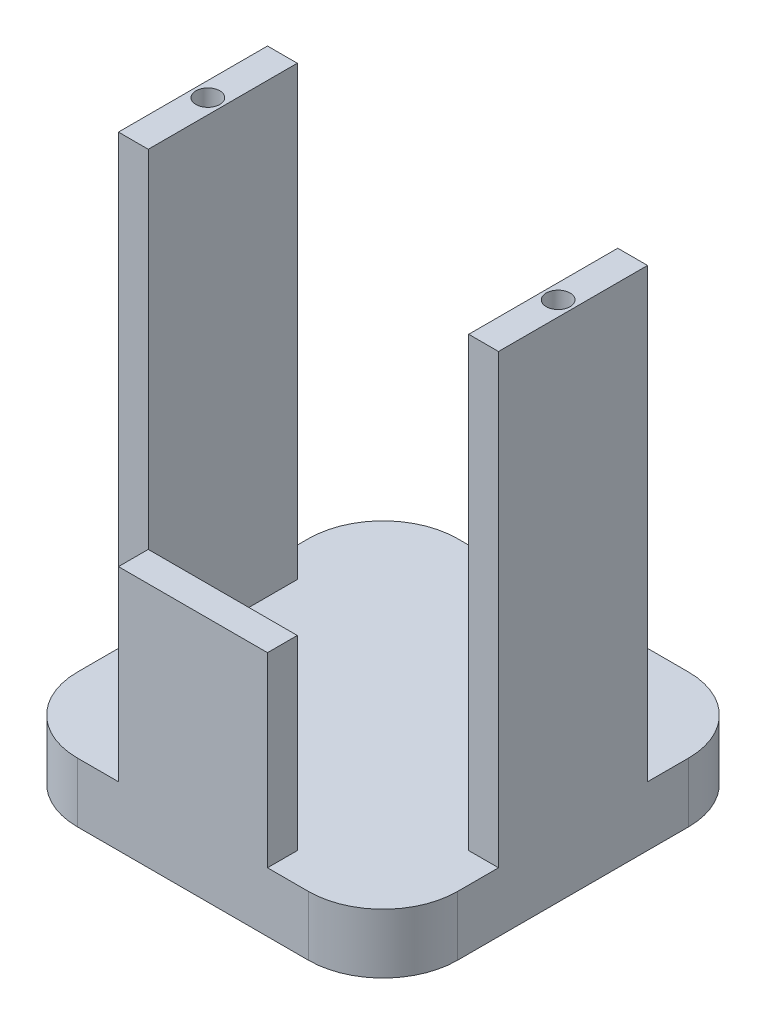
ISO-10303-21;
HEADER;
FILE_DESCRIPTION(('STEP AP214'),'2;1');
FILE_NAME('part.step','',(''),(''),'','','');
FILE_SCHEMA(('AUTOMOTIVE_DESIGN { 1 0 10303 214 1 1 1 1 }'));
ENDSEC;
DATA;
#1=APPLICATION_CONTEXT('core data for automotive mechanical design processes');
#2=APPLICATION_PROTOCOL_DEFINITION('international standard','automotive_design',2000,#1);
#3=PRODUCT_CONTEXT('',#1,'mechanical');
#4=PRODUCT('Part','Part','',(#3));
#5=PRODUCT_RELATED_PRODUCT_CATEGORY('part','',(#4));
#6=PRODUCT_DEFINITION_FORMATION('','',#4);
#7=PRODUCT_DEFINITION_CONTEXT('part definition',#1,'design');
#8=PRODUCT_DEFINITION('design','',#6,#7);
#9=PRODUCT_DEFINITION_SHAPE('','',#8);
#10=(LENGTH_UNIT() NAMED_UNIT(*) SI_UNIT(.MILLI.,.METRE.));
#11=(NAMED_UNIT(*) PLANE_ANGLE_UNIT() SI_UNIT($,.RADIAN.));
#12=(NAMED_UNIT(*) SI_UNIT($,.STERADIAN.) SOLID_ANGLE_UNIT());
#13=UNCERTAINTY_MEASURE_WITH_UNIT(LENGTH_MEASURE(1.E-05),#10,'distance_accuracy_value','');
#14=(GEOMETRIC_REPRESENTATION_CONTEXT(3) GLOBAL_UNCERTAINTY_ASSIGNED_CONTEXT((#13)) GLOBAL_UNIT_ASSIGNED_CONTEXT((#10,
#11,#12)) REPRESENTATION_CONTEXT('',''));
#15=CARTESIAN_POINT('',(0.,0.,0.));
#16=DIRECTION('',(0.,0.,1.));
#17=DIRECTION('',(1.,0.,0.));
#18=AXIS2_PLACEMENT_3D('',#15,#16,#17);
#19=CARTESIAN_POINT('',(0.,8.,0.));
#20=DIRECTION('',(0.,-1.,0.));
#21=DIRECTION('',(0.,0.,-1.));
#22=AXIS2_PLACEMENT_3D('',#19,#20,#21);
#23=PLANE('',#22);
#24=DIRECTION('',(-1.,0.,0.));
#25=VECTOR('',#24,1.);
#26=CARTESIAN_POINT('',(-25.5,8.,-25.5));
#27=LINE('',#26,#25);
#28=CARTESIAN_POINT('',(-10.,8.,-25.5));
#29=VERTEX_POINT('',#28);
#30=CARTESIAN_POINT('',(-15.5,8.,-25.5));
#31=VERTEX_POINT('',#30);
#32=EDGE_CURVE('E354',#29,#31,#27,.T.);
#33=ORIENTED_EDGE('',*,*,#32,.T.);
#34=CARTESIAN_POINT('',(-15.5,8.,-15.5));
#35=DIRECTION('',(0.,-1.,0.));
#36=DIRECTION('',(0.,0.,-1.));
#37=AXIS2_PLACEMENT_3D('',#34,#35,#36);
#38=CIRCLE('',#37,10.);
#39=CARTESIAN_POINT('',(-25.5,8.,-15.5));
#40=VERTEX_POINT('',#39);
#41=EDGE_CURVE('E392',#31,#40,#38,.F.);
#42=ORIENTED_EDGE('',*,*,#41,.T.);
#43=DIRECTION('',(0.,0.,1.));
#44=VECTOR('',#43,1.);
#45=CARTESIAN_POINT('',(-25.5,8.,25.5));
#46=LINE('',#45,#44);
#47=CARTESIAN_POINT('',(-25.5,8.,-10.));
#48=VERTEX_POINT('',#47);
#49=EDGE_CURVE('E212',#40,#48,#46,.T.);
#50=ORIENTED_EDGE('',*,*,#49,.T.);
#51=DIRECTION('',(-1.,0.,0.));
#52=VECTOR('',#51,1.);
#53=CARTESIAN_POINT('',(-25.5,8.,-10.));
#54=LINE('',#53,#52);
#55=CARTESIAN_POINT('',(-21.5,8.,-10.));
#56=VERTEX_POINT('',#55);
#57=EDGE_CURVE('E326',#56,#48,#54,.T.);
#58=ORIENTED_EDGE('',*,*,#57,.F.);
#59=DIRECTION('',(0.,0.,-1.));
#60=VECTOR('',#59,1.);
#61=CARTESIAN_POINT('',(-21.5,8.,-10.));
#62=LINE('',#61,#60);
#63=CARTESIAN_POINT('',(-21.5,8.,10.));
#64=VERTEX_POINT('',#63);
#65=EDGE_CURVE('E335',#64,#56,#62,.T.);
#66=ORIENTED_EDGE('',*,*,#65,.F.);
#67=DIRECTION('',(1.,0.,0.));
#68=VECTOR('',#67,1.);
#69=CARTESIAN_POINT('',(-25.5,8.,10.));
#70=LINE('',#69,#68);
#71=CARTESIAN_POINT('',(-25.5,8.,10.));
#72=VERTEX_POINT('',#71);
#73=EDGE_CURVE('E314',#72,#64,#70,.T.);
#74=ORIENTED_EDGE('',*,*,#73,.F.);
#75=CARTESIAN_POINT('',(-25.5,8.,15.5));
#76=VERTEX_POINT('',#75);
#77=EDGE_CURVE('E358',#72,#76,#46,.T.);
#78=ORIENTED_EDGE('',*,*,#77,.T.);
#79=CARTESIAN_POINT('',(-15.5,8.,15.5));
#80=DIRECTION('',(0.,-1.,0.));
#81=DIRECTION('',(0.,0.,-1.));
#82=AXIS2_PLACEMENT_3D('',#79,#80,#81);
#83=CIRCLE('',#82,10.);
#84=CARTESIAN_POINT('',(-15.5,8.,25.5));
#85=VERTEX_POINT('',#84);
#86=EDGE_CURVE('E54',#76,#85,#83,.F.);
#87=ORIENTED_EDGE('',*,*,#86,.T.);
#88=DIRECTION('',(1.,0.,0.));
#89=VECTOR('',#88,1.);
#90=CARTESIAN_POINT('',(-25.5,8.,25.5));
#91=LINE('',#90,#89);
#92=CARTESIAN_POINT('',(-10.,8.,25.5));
#93=VERTEX_POINT('',#92);
#94=EDGE_CURVE('E211',#85,#93,#91,.T.);
#95=ORIENTED_EDGE('',*,*,#94,.T.);
#96=DIRECTION('',(0.,0.,1.));
#97=VECTOR('',#96,1.);
#98=CARTESIAN_POINT('',(-10.,8.,25.5));
#99=LINE('',#98,#97);
#100=CARTESIAN_POINT('',(-10.,8.,21.5));
#101=VERTEX_POINT('',#100);
#102=EDGE_CURVE('E222',#101,#93,#99,.T.);
#103=ORIENTED_EDGE('',*,*,#102,.F.);
#104=DIRECTION('',(-1.,0.,0.));
#105=VECTOR('',#104,1.);
#106=CARTESIAN_POINT('',(-10.,8.,21.5));
#107=LINE('',#106,#105);
#108=CARTESIAN_POINT('',(10.,8.,21.5));
#109=VERTEX_POINT('',#108);
#110=EDGE_CURVE('E218',#109,#101,#107,.T.);
#111=ORIENTED_EDGE('',*,*,#110,.F.);
#112=DIRECTION('',(0.,0.,-1.));
#113=VECTOR('',#112,1.);
#114=CARTESIAN_POINT('',(10.,8.,25.5));
#115=LINE('',#114,#113);
#116=CARTESIAN_POINT('',(10.,8.,25.5));
#117=VERTEX_POINT('',#116);
#118=EDGE_CURVE('E215',#117,#109,#115,.T.);
#119=ORIENTED_EDGE('',*,*,#118,.F.);
#120=CARTESIAN_POINT('',(15.5,8.,25.5));
#121=VERTEX_POINT('',#120);
#122=EDGE_CURVE('E202',#117,#121,#91,.T.);
#123=ORIENTED_EDGE('',*,*,#122,.T.);
#124=CARTESIAN_POINT('',(15.5,8.,15.5));
#125=DIRECTION('',(0.,-1.,0.));
#126=DIRECTION('',(0.,0.,-1.));
#127=AXIS2_PLACEMENT_3D('',#124,#125,#126);
#128=CIRCLE('',#127,10.);
#129=CARTESIAN_POINT('',(25.5,8.,15.5));
#130=VERTEX_POINT('',#129);
#131=EDGE_CURVE('E387',#121,#130,#128,.F.);
#132=ORIENTED_EDGE('',*,*,#131,.T.);
#133=DIRECTION('',(0.,0.,-1.));
#134=VECTOR('',#133,1.);
#135=CARTESIAN_POINT('',(25.5,8.,25.5));
#136=LINE('',#135,#134);
#137=CARTESIAN_POINT('',(25.5,8.,10.));
#138=VERTEX_POINT('',#137);
#139=EDGE_CURVE('E352',#130,#138,#136,.T.);
#140=ORIENTED_EDGE('',*,*,#139,.T.);
#141=DIRECTION('',(1.,0.,0.));
#142=VECTOR('',#141,1.);
#143=CARTESIAN_POINT('',(25.5,8.,10.));
#144=LINE('',#143,#142);
#145=CARTESIAN_POINT('',(21.5,8.,10.));
#146=VERTEX_POINT('',#145);
#147=EDGE_CURVE('E304',#146,#138,#144,.T.);
#148=ORIENTED_EDGE('',*,*,#147,.F.);
#149=DIRECTION('',(0.,0.,1.));
#150=VECTOR('',#149,1.);
#151=CARTESIAN_POINT('',(21.5,8.,-10.));
#152=LINE('',#151,#150);
#153=CARTESIAN_POINT('',(21.5,8.,-10.));
#154=VERTEX_POINT('',#153);
#155=EDGE_CURVE('E307',#154,#146,#152,.T.);
#156=ORIENTED_EDGE('',*,*,#155,.F.);
#157=DIRECTION('',(-1.,0.,0.));
#158=VECTOR('',#157,1.);
#159=CARTESIAN_POINT('',(25.5,8.,-10.));
#160=LINE('',#159,#158);
#161=CARTESIAN_POINT('',(25.5,8.,-10.));
#162=VERTEX_POINT('',#161);
#163=EDGE_CURVE('E311',#162,#154,#160,.T.);
#164=ORIENTED_EDGE('',*,*,#163,.F.);
#165=CARTESIAN_POINT('',(25.5,8.,-15.5));
#166=VERTEX_POINT('',#165);
#167=EDGE_CURVE('E355',#162,#166,#136,.T.);
#168=ORIENTED_EDGE('',*,*,#167,.T.);
#169=CARTESIAN_POINT('',(15.5,8.,-15.5));
#170=DIRECTION('',(0.,-1.,0.));
#171=DIRECTION('',(0.,0.,-1.));
#172=AXIS2_PLACEMENT_3D('',#169,#170,#171);
#173=CIRCLE('',#172,10.);
#174=CARTESIAN_POINT('',(15.5,8.,-25.5));
#175=VERTEX_POINT('',#174);
#176=EDGE_CURVE('E390',#166,#175,#173,.F.);
#177=ORIENTED_EDGE('',*,*,#176,.T.);
#178=CARTESIAN_POINT('',(9.99999999999999,8.,-25.5));
#179=VERTEX_POINT('',#178);
#180=EDGE_CURVE('E356',#175,#179,#27,.T.);
#181=ORIENTED_EDGE('',*,*,#180,.T.);
#182=DIRECTION('',(0.,0.,-1.));
#183=VECTOR('',#182,1.);
#184=CARTESIAN_POINT('',(9.99999999999999,8.,-25.5));
#185=LINE('',#184,#183);
#186=CARTESIAN_POINT('',(9.99999999999999,8.,-21.5));
#187=VERTEX_POINT('',#186);
#188=EDGE_CURVE('E254',#187,#179,#185,.T.);
#189=ORIENTED_EDGE('',*,*,#188,.F.);
#190=DIRECTION('',(1.,0.,0.));
#191=VECTOR('',#190,1.);
#192=CARTESIAN_POINT('',(-10.,8.,-21.5));
#193=LINE('',#192,#191);
#194=CARTESIAN_POINT('',(-10.,8.,-21.5));
#195=VERTEX_POINT('',#194);
#196=EDGE_CURVE('E263',#195,#187,#193,.T.);
#197=ORIENTED_EDGE('',*,*,#196,.F.);
#198=DIRECTION('',(0.,0.,1.));
#199=VECTOR('',#198,1.);
#200=CARTESIAN_POINT('',(-10.,8.,-25.5));
#201=LINE('',#200,#199);
#202=EDGE_CURVE('E243',#29,#195,#201,.T.);
#203=ORIENTED_EDGE('',*,*,#202,.F.);
#204=EDGE_LOOP('',(#33,#42,#50,#58,#66,#74,#78,#87,#95,#103,#111,#119,#123,#132,#140,#148,#156,
#164,#168,#177,#181,#189,#197,#203));
#205=FACE_BOUND('',#204,.T.);
#206=ADVANCED_FACE('F39',(#205),#23,.F.);
#207=CARTESIAN_POINT('',(25.5,8.,25.5));
#208=DIRECTION('',(-1.,0.,0.));
#209=DIRECTION('',(0.,0.,1.));
#210=AXIS2_PLACEMENT_3D('',#207,#208,#209);
#211=PLANE('',#210);
#212=DIRECTION('',(0.,0.,-1.));
#213=VECTOR('',#212,1.);
#214=CARTESIAN_POINT('',(25.5,0.,25.5));
#215=LINE('',#214,#213);
#216=CARTESIAN_POINT('',(25.5,0.,15.5));
#217=VERTEX_POINT('',#216);
#218=CARTESIAN_POINT('',(25.5,0.,-15.5));
#219=VERTEX_POINT('',#218);
#220=EDGE_CURVE('E351',#217,#219,#215,.T.);
#221=ORIENTED_EDGE('',*,*,#220,.T.);
#222=DIRECTION('',(0.,-1.,0.));
#223=VECTOR('',#222,1.);
#224=CARTESIAN_POINT('',(25.5,8.,-15.5));
#225=LINE('',#224,#223);
#226=EDGE_CURVE('E62',#219,#166,#225,.F.);
#227=ORIENTED_EDGE('',*,*,#226,.T.);
#228=ORIENTED_EDGE('',*,*,#167,.F.);
#229=DIRECTION('',(0.,-1.,0.));
#230=VECTOR('',#229,1.);
#231=CARTESIAN_POINT('',(25.5,68.,-10.));
#232=LINE('',#231,#230);
#233=CARTESIAN_POINT('',(25.5,68.,-10.));
#234=VERTEX_POINT('',#233);
#235=EDGE_CURVE('E283',#234,#162,#232,.T.);
#236=ORIENTED_EDGE('',*,*,#235,.F.);
#237=DIRECTION('',(0.,0.,-1.));
#238=VECTOR('',#237,1.);
#239=CARTESIAN_POINT('',(25.5,68.,-10.));
#240=LINE('',#239,#238);
#241=CARTESIAN_POINT('',(25.5,68.,10.));
#242=VERTEX_POINT('',#241);
#243=EDGE_CURVE('E308',#242,#234,#240,.T.);
#244=ORIENTED_EDGE('',*,*,#243,.F.);
#245=DIRECTION('',(0.,-1.,0.));
#246=VECTOR('',#245,1.);
#247=CARTESIAN_POINT('',(25.5,68.,10.));
#248=LINE('',#247,#246);
#249=EDGE_CURVE('E300',#242,#138,#248,.T.);
#250=ORIENTED_EDGE('',*,*,#249,.T.);
#251=ORIENTED_EDGE('',*,*,#139,.F.);
#252=DIRECTION('',(0.,-1.,0.));
#253=VECTOR('',#252,1.);
#254=CARTESIAN_POINT('',(25.5,8.,15.5));
#255=LINE('',#254,#253);
#256=EDGE_CURVE('E394',#130,#217,#255,.T.);
#257=ORIENTED_EDGE('',*,*,#256,.T.);
#258=EDGE_LOOP('',(#221,#227,#228,#236,#244,#250,#251,#257));
#259=FACE_BOUND('',#258,.T.);
#260=ADVANCED_FACE('F400',(#259),#211,.F.);
#261=CARTESIAN_POINT('',(-25.5,8.,-25.5));
#262=DIRECTION('',(0.,0.,1.));
#263=DIRECTION('',(1.,0.,0.));
#264=AXIS2_PLACEMENT_3D('',#261,#262,#263);
#265=PLANE('',#264);
#266=DIRECTION('',(-1.,0.,0.));
#267=VECTOR('',#266,1.);
#268=CARTESIAN_POINT('',(-25.5,0.,-25.5));
#269=LINE('',#268,#267);
#270=CARTESIAN_POINT('',(15.5,0.,-25.5));
#271=VERTEX_POINT('',#270);
#272=CARTESIAN_POINT('',(-15.5,0.,-25.5));
#273=VERTEX_POINT('',#272);
#274=EDGE_CURVE('E362',#271,#273,#269,.T.);
#275=ORIENTED_EDGE('',*,*,#274,.T.);
#276=DIRECTION('',(0.,-1.,0.));
#277=VECTOR('',#276,1.);
#278=CARTESIAN_POINT('',(-15.5,8.,-25.5));
#279=LINE('',#278,#277);
#280=EDGE_CURVE('E385',#273,#31,#279,.F.);
#281=ORIENTED_EDGE('',*,*,#280,.T.);
#282=ORIENTED_EDGE('',*,*,#32,.F.);
#283=DIRECTION('',(0.,-1.,0.));
#284=VECTOR('',#283,1.);
#285=CARTESIAN_POINT('',(-10.,33.,-25.5));
#286=LINE('',#285,#284);
#287=CARTESIAN_POINT('',(-10.,33.,-25.5));
#288=VERTEX_POINT('',#287);
#289=EDGE_CURVE('E260',#288,#29,#286,.T.);
#290=ORIENTED_EDGE('',*,*,#289,.F.);
#291=DIRECTION('',(-1.,0.,0.));
#292=VECTOR('',#291,1.);
#293=CARTESIAN_POINT('',(-10.,33.,-25.5));
#294=LINE('',#293,#292);
#295=CARTESIAN_POINT('',(9.99999999999999,33.,-25.5));
#296=VERTEX_POINT('',#295);
#297=EDGE_CURVE('E258',#296,#288,#294,.T.);
#298=ORIENTED_EDGE('',*,*,#297,.F.);
#299=DIRECTION('',(0.,-1.,0.));
#300=VECTOR('',#299,1.);
#301=CARTESIAN_POINT('',(9.99999999999999,33.,-25.5));
#302=LINE('',#301,#300);
#303=EDGE_CURVE('E270',#296,#179,#302,.T.);
#304=ORIENTED_EDGE('',*,*,#303,.T.);
#305=ORIENTED_EDGE('',*,*,#180,.F.);
#306=DIRECTION('',(0.,-1.,0.));
#307=VECTOR('',#306,1.);
#308=CARTESIAN_POINT('',(15.5,8.,-25.5));
#309=LINE('',#308,#307);
#310=EDGE_CURVE('E382',#175,#271,#309,.T.);
#311=ORIENTED_EDGE('',*,*,#310,.T.);
#312=EDGE_LOOP('',(#275,#281,#282,#290,#298,#304,#305,#311));
#313=FACE_BOUND('',#312,.T.);
#314=ADVANCED_FACE('F413',(#313),#265,.F.);
#315=CARTESIAN_POINT('',(-25.5,8.,25.5));
#316=DIRECTION('',(1.,0.,0.));
#317=DIRECTION('',(0.,0.,-1.));
#318=AXIS2_PLACEMENT_3D('',#315,#316,#317);
#319=PLANE('',#318);
#320=ORIENTED_EDGE('',*,*,#49,.F.);
#321=DIRECTION('',(0.,-1.,0.));
#322=VECTOR('',#321,1.);
#323=CARTESIAN_POINT('',(-25.5,8.,-15.5));
#324=LINE('',#323,#322);
#325=CARTESIAN_POINT('',(-25.5,0.,-15.5));
#326=VERTEX_POINT('',#325);
#327=EDGE_CURVE('E371',#40,#326,#324,.T.);
#328=ORIENTED_EDGE('',*,*,#327,.T.);
#329=DIRECTION('',(0.,0.,1.));
#330=VECTOR('',#329,1.);
#331=CARTESIAN_POINT('',(-25.5,0.,25.5));
#332=LINE('',#331,#330);
#333=CARTESIAN_POINT('',(-25.5,0.,15.5));
#334=VERTEX_POINT('',#333);
#335=EDGE_CURVE('E365',#326,#334,#332,.T.);
#336=ORIENTED_EDGE('',*,*,#335,.T.);
#337=DIRECTION('',(0.,-1.,0.));
#338=VECTOR('',#337,1.);
#339=CARTESIAN_POINT('',(-25.5,8.,15.5));
#340=LINE('',#339,#338);
#341=EDGE_CURVE('E360',#334,#76,#340,.F.);
#342=ORIENTED_EDGE('',*,*,#341,.T.);
#343=ORIENTED_EDGE('',*,*,#77,.F.);
#344=DIRECTION('',(0.,-1.,0.));
#345=VECTOR('',#344,1.);
#346=CARTESIAN_POINT('',(-25.5,68.,10.));
#347=LINE('',#346,#345);
#348=CARTESIAN_POINT('',(-25.5,68.,10.));
#349=VERTEX_POINT('',#348);
#350=EDGE_CURVE('E348',#349,#72,#347,.T.);
#351=ORIENTED_EDGE('',*,*,#350,.F.);
#352=DIRECTION('',(0.,0.,1.));
#353=VECTOR('',#352,1.);
#354=CARTESIAN_POINT('',(-25.5,68.,-10.));
#355=LINE('',#354,#353);
#356=CARTESIAN_POINT('',(-25.5,68.,-10.));
#357=VERTEX_POINT('',#356);
#358=EDGE_CURVE('E322',#357,#349,#355,.T.);
#359=ORIENTED_EDGE('',*,*,#358,.F.);
#360=DIRECTION('',(0.,-1.,0.));
#361=VECTOR('',#360,1.);
#362=CARTESIAN_POINT('',(-25.5,68.,-10.));
#363=LINE('',#362,#361);
#364=EDGE_CURVE('E332',#357,#48,#363,.T.);
#365=ORIENTED_EDGE('',*,*,#364,.T.);
#366=EDGE_LOOP('',(#320,#328,#336,#342,#343,#351,#359,#365));
#367=FACE_BOUND('',#366,.T.);
#368=ADVANCED_FACE('F435',(#367),#319,.F.);
#369=CARTESIAN_POINT('',(-25.5,8.,25.5));
#370=DIRECTION('',(0.,0.,-1.));
#371=DIRECTION('',(-1.,0.,0.));
#372=AXIS2_PLACEMENT_3D('',#369,#370,#371);
#373=PLANE('',#372);
#374=ORIENTED_EDGE('',*,*,#94,.F.);
#375=DIRECTION('',(0.,-1.,0.));
#376=VECTOR('',#375,1.);
#377=CARTESIAN_POINT('',(-15.5,8.,25.5));
#378=LINE('',#377,#376);
#379=CARTESIAN_POINT('',(-15.5,0.,25.5));
#380=VERTEX_POINT('',#379);
#381=EDGE_CURVE('E11',#85,#380,#378,.T.);
#382=ORIENTED_EDGE('',*,*,#381,.T.);
#383=DIRECTION('',(1.,0.,0.));
#384=VECTOR('',#383,1.);
#385=CARTESIAN_POINT('',(-25.5,0.,25.5));
#386=LINE('',#385,#384);
#387=CARTESIAN_POINT('',(15.5,0.,25.5));
#388=VERTEX_POINT('',#387);
#389=EDGE_CURVE('E368',#380,#388,#386,.T.);
#390=ORIENTED_EDGE('',*,*,#389,.T.);
#391=DIRECTION('',(0.,-1.,0.));
#392=VECTOR('',#391,1.);
#393=CARTESIAN_POINT('',(15.5,8.,25.5));
#394=LINE('',#393,#392);
#395=EDGE_CURVE('E47',#388,#121,#394,.F.);
#396=ORIENTED_EDGE('',*,*,#395,.T.);
#397=ORIENTED_EDGE('',*,*,#122,.F.);
#398=DIRECTION('',(0.,-1.,0.));
#399=VECTOR('',#398,1.);
#400=CARTESIAN_POINT('',(10.,33.,25.5));
#401=LINE('',#400,#399);
#402=CARTESIAN_POINT('',(10.,33.,25.5));
#403=VERTEX_POINT('',#402);
#404=EDGE_CURVE('E206',#403,#117,#401,.T.);
#405=ORIENTED_EDGE('',*,*,#404,.F.);
#406=DIRECTION('',(1.,0.,0.));
#407=VECTOR('',#406,1.);
#408=CARTESIAN_POINT('',(-10.,33.,25.5));
#409=LINE('',#408,#407);
#410=CARTESIAN_POINT('',(-10.,33.,25.5));
#411=VERTEX_POINT('',#410);
#412=EDGE_CURVE('E246',#411,#403,#409,.T.);
#413=ORIENTED_EDGE('',*,*,#412,.F.);
#414=DIRECTION('',(0.,-1.,0.));
#415=VECTOR('',#414,1.);
#416=CARTESIAN_POINT('',(-10.,33.,25.5));
#417=LINE('',#416,#415);
#418=EDGE_CURVE('E227',#411,#93,#417,.T.);
#419=ORIENTED_EDGE('',*,*,#418,.T.);
#420=EDGE_LOOP('',(#374,#382,#390,#396,#397,#405,#413,#419));
#421=FACE_BOUND('',#420,.T.);
#422=ADVANCED_FACE('F204',(#421),#373,.F.);
#423=CARTESIAN_POINT('',(0.,0.,0.));
#424=DIRECTION('',(0.,-1.,0.));
#425=DIRECTION('',(0.,0.,-1.));
#426=AXIS2_PLACEMENT_3D('',#423,#424,#425);
#427=PLANE('',#426);
#428=CARTESIAN_POINT('',(-11.,0.,-11.));
#429=DIRECTION('',(0.,-1.,0.));
#430=DIRECTION('',(0.,0.,1.));
#431=AXIS2_PLACEMENT_3D('',#428,#429,#430);
#432=CIRCLE('',#431,1.6);
#433=CARTESIAN_POINT('',(-11.,0.,-9.4));
#434=VERTEX_POINT('',#433);
#435=EDGE_CURVE('E826',#434,#434,#432,.T.);
#436=ORIENTED_EDGE('',*,*,#435,.F.);
#437=EDGE_LOOP('',(#436));
#438=FACE_BOUND('',#437,.T.);
#439=CARTESIAN_POINT('',(11.,0.,-11.));
#440=DIRECTION('',(0.,-1.,0.));
#441=DIRECTION('',(0.,0.,-1.));
#442=AXIS2_PLACEMENT_3D('',#439,#440,#441);
#443=CIRCLE('',#442,1.59999999999999);
#444=CARTESIAN_POINT('',(11.,0.,-12.6));
#445=VERTEX_POINT('',#444);
#446=EDGE_CURVE('E845',#445,#445,#443,.T.);
#447=ORIENTED_EDGE('',*,*,#446,.F.);
#448=EDGE_LOOP('',(#447));
#449=FACE_BOUND('',#448,.T.);
#450=CARTESIAN_POINT('',(11.,0.,11.));
#451=DIRECTION('',(0.,-1.,0.));
#452=DIRECTION('',(0.,0.,1.));
#453=AXIS2_PLACEMENT_3D('',#450,#451,#452);
#454=CIRCLE('',#453,1.6);
#455=CARTESIAN_POINT('',(11.,0.,12.6));
#456=VERTEX_POINT('',#455);
#457=EDGE_CURVE('E836',#456,#456,#454,.T.);
#458=ORIENTED_EDGE('',*,*,#457,.F.);
#459=EDGE_LOOP('',(#458));
#460=FACE_BOUND('',#459,.T.);
#461=CARTESIAN_POINT('',(-11.,0.,11.));
#462=DIRECTION('',(0.,-1.,0.));
#463=DIRECTION('',(0.,0.,-1.));
#464=AXIS2_PLACEMENT_3D('',#461,#462,#463);
#465=CIRCLE('',#464,1.6);
#466=CARTESIAN_POINT('',(-11.,0.,9.4));
#467=VERTEX_POINT('',#466);
#468=EDGE_CURVE('E834',#467,#467,#465,.T.);
#469=ORIENTED_EDGE('',*,*,#468,.F.);
#470=EDGE_LOOP('',(#469));
#471=FACE_BOUND('',#470,.T.);
#472=ORIENTED_EDGE('',*,*,#335,.F.);
#473=CARTESIAN_POINT('',(-15.5,0.,-15.5));
#474=DIRECTION('',(0.,-1.,0.));
#475=DIRECTION('',(0.,0.,-1.));
#476=AXIS2_PLACEMENT_3D('',#473,#474,#475);
#477=CIRCLE('',#476,10.);
#478=EDGE_CURVE('E380',#326,#273,#477,.T.);
#479=ORIENTED_EDGE('',*,*,#478,.T.);
#480=ORIENTED_EDGE('',*,*,#274,.F.);
#481=CARTESIAN_POINT('',(15.5,0.,-15.5));
#482=DIRECTION('',(0.,-1.,0.));
#483=DIRECTION('',(0.,0.,-1.));
#484=AXIS2_PLACEMENT_3D('',#481,#482,#483);
#485=CIRCLE('',#484,10.);
#486=EDGE_CURVE('E378',#271,#219,#485,.T.);
#487=ORIENTED_EDGE('',*,*,#486,.T.);
#488=ORIENTED_EDGE('',*,*,#220,.F.);
#489=CARTESIAN_POINT('',(15.5,0.,15.5));
#490=DIRECTION('',(0.,-1.,0.));
#491=DIRECTION('',(0.,0.,-1.));
#492=AXIS2_PLACEMENT_3D('',#489,#490,#491);
#493=CIRCLE('',#492,10.);
#494=EDGE_CURVE('E374',#217,#388,#493,.T.);
#495=ORIENTED_EDGE('',*,*,#494,.T.);
#496=ORIENTED_EDGE('',*,*,#389,.F.);
#497=CARTESIAN_POINT('',(-15.5,0.,15.5));
#498=DIRECTION('',(0.,-1.,0.));
#499=DIRECTION('',(0.,0.,-1.));
#500=AXIS2_PLACEMENT_3D('',#497,#498,#499);
#501=CIRCLE('',#500,10.);
#502=EDGE_CURVE('E376',#380,#334,#501,.T.);
#503=ORIENTED_EDGE('',*,*,#502,.T.);
#504=EDGE_LOOP('',(#472,#479,#480,#487,#488,#495,#496,#503));
#505=FACE_BOUND('',#504,.T.);
#506=ADVANCED_FACE('F404',(#438,#449,#460,#471,#505),#427,.T.);
#507=CARTESIAN_POINT('',(-25.5,68.,10.));
#508=DIRECTION('',(0.,0.,-1.));
#509=DIRECTION('',(-1.,0.,0.));
#510=AXIS2_PLACEMENT_3D('',#507,#508,#509);
#511=PLANE('',#510);
#512=ORIENTED_EDGE('',*,*,#73,.T.);
#513=DIRECTION('',(0.,-1.,0.));
#514=VECTOR('',#513,1.);
#515=CARTESIAN_POINT('',(-21.5,68.,10.));
#516=LINE('',#515,#514);
#517=CARTESIAN_POINT('',(-21.5,68.,10.));
#518=VERTEX_POINT('',#517);
#519=EDGE_CURVE('E345',#518,#64,#516,.T.);
#520=ORIENTED_EDGE('',*,*,#519,.F.);
#521=DIRECTION('',(1.,0.,0.));
#522=VECTOR('',#521,1.);
#523=CARTESIAN_POINT('',(-25.5,68.,10.));
#524=LINE('',#523,#522);
#525=EDGE_CURVE('E325',#349,#518,#524,.T.);
#526=ORIENTED_EDGE('',*,*,#525,.F.);
#527=ORIENTED_EDGE('',*,*,#350,.T.);
#528=EDGE_LOOP('',(#512,#520,#526,#527));
#529=FACE_BOUND('',#528,.T.);
#530=ADVANCED_FACE('F448',(#529),#511,.F.);
#531=CARTESIAN_POINT('',(-21.5,68.,-10.));
#532=DIRECTION('',(-1.,0.,0.));
#533=DIRECTION('',(0.,0.,1.));
#534=AXIS2_PLACEMENT_3D('',#531,#532,#533);
#535=PLANE('',#534);
#536=ORIENTED_EDGE('',*,*,#65,.T.);
#537=DIRECTION('',(0.,-1.,0.));
#538=VECTOR('',#537,1.);
#539=CARTESIAN_POINT('',(-21.5,68.,-10.));
#540=LINE('',#539,#538);
#541=CARTESIAN_POINT('',(-21.5,68.,-10.));
#542=VERTEX_POINT('',#541);
#543=EDGE_CURVE('E342',#542,#56,#540,.T.);
#544=ORIENTED_EDGE('',*,*,#543,.F.);
#545=DIRECTION('',(0.,0.,-1.));
#546=VECTOR('',#545,1.);
#547=CARTESIAN_POINT('',(-21.5,68.,-10.));
#548=LINE('',#547,#546);
#549=EDGE_CURVE('E328',#518,#542,#548,.T.);
#550=ORIENTED_EDGE('',*,*,#549,.F.);
#551=ORIENTED_EDGE('',*,*,#519,.T.);
#552=EDGE_LOOP('',(#536,#544,#550,#551));
#553=FACE_BOUND('',#552,.T.);
#554=ADVANCED_FACE('F444',(#553),#535,.F.);
#555=CARTESIAN_POINT('',(-25.5,68.,-10.));
#556=DIRECTION('',(0.,0.,1.));
#557=DIRECTION('',(1.,0.,0.));
#558=AXIS2_PLACEMENT_3D('',#555,#556,#557);
#559=PLANE('',#558);
#560=ORIENTED_EDGE('',*,*,#57,.T.);
#561=ORIENTED_EDGE('',*,*,#364,.F.);
#562=DIRECTION('',(-1.,0.,0.));
#563=VECTOR('',#562,1.);
#564=CARTESIAN_POINT('',(-25.5,68.,-10.));
#565=LINE('',#564,#563);
#566=EDGE_CURVE('E330',#542,#357,#565,.T.);
#567=ORIENTED_EDGE('',*,*,#566,.F.);
#568=ORIENTED_EDGE('',*,*,#543,.T.);
#569=EDGE_LOOP('',(#560,#561,#567,#568));
#570=FACE_BOUND('',#569,.T.);
#571=ADVANCED_FACE('F441',(#570),#559,.F.);
#572=CARTESIAN_POINT('',(0.,68.,0.));
#573=DIRECTION('',(0.,1.,0.));
#574=DIRECTION('',(0.,0.,1.));
#575=AXIS2_PLACEMENT_3D('',#572,#573,#574);
#576=PLANE('',#575);
#577=CARTESIAN_POINT('',(-23.5,68.,0.));
#578=DIRECTION('',(0.,1.,0.));
#579=DIRECTION('',(0.,0.,1.));
#580=AXIS2_PLACEMENT_3D('',#577,#578,#579);
#581=CIRCLE('',#580,1.6);
#582=CARTESIAN_POINT('',(-23.5,68.,1.6));
#583=VERTEX_POINT('',#582);
#584=EDGE_CURVE('E284',#583,#583,#581,.T.);
#585=ORIENTED_EDGE('',*,*,#584,.F.);
#586=EDGE_LOOP('',(#585));
#587=FACE_BOUND('',#586,.T.);
#588=ORIENTED_EDGE('',*,*,#358,.T.);
#589=ORIENTED_EDGE('',*,*,#525,.T.);
#590=ORIENTED_EDGE('',*,*,#549,.T.);
#591=ORIENTED_EDGE('',*,*,#566,.T.);
#592=EDGE_LOOP('',(#588,#589,#590,#591));
#593=FACE_BOUND('',#592,.T.);
#594=ADVANCED_FACE('F522',(#587,#593),#576,.T.);
#595=CARTESIAN_POINT('',(25.5,68.,-10.));
#596=DIRECTION('',(0.,0.,1.));
#597=DIRECTION('',(1.,0.,0.));
#598=AXIS2_PLACEMENT_3D('',#595,#596,#597);
#599=PLANE('',#598);
#600=ORIENTED_EDGE('',*,*,#163,.T.);
#601=DIRECTION('',(0.,-1.,0.));
#602=VECTOR('',#601,1.);
#603=CARTESIAN_POINT('',(21.5,68.,-10.));
#604=LINE('',#603,#602);
#605=CARTESIAN_POINT('',(21.5,68.,-10.));
#606=VERTEX_POINT('',#605);
#607=EDGE_CURVE('E294',#606,#154,#604,.T.);
#608=ORIENTED_EDGE('',*,*,#607,.F.);
#609=DIRECTION('',(-1.,0.,0.));
#610=VECTOR('',#609,1.);
#611=CARTESIAN_POINT('',(25.5,68.,-10.));
#612=LINE('',#611,#610);
#613=EDGE_CURVE('E318',#234,#606,#612,.T.);
#614=ORIENTED_EDGE('',*,*,#613,.F.);
#615=ORIENTED_EDGE('',*,*,#235,.T.);
#616=EDGE_LOOP('',(#600,#608,#614,#615));
#617=FACE_BOUND('',#616,.T.);
#618=ADVANCED_FACE('F520',(#617),#599,.F.);
#619=CARTESIAN_POINT('',(21.5,68.,-10.));
#620=DIRECTION('',(1.,0.,0.));
#621=DIRECTION('',(0.,0.,-1.));
#622=AXIS2_PLACEMENT_3D('',#619,#620,#621);
#623=PLANE('',#622);
#624=ORIENTED_EDGE('',*,*,#155,.T.);
#625=DIRECTION('',(0.,-1.,0.));
#626=VECTOR('',#625,1.);
#627=CARTESIAN_POINT('',(21.5,68.,10.));
#628=LINE('',#627,#626);
#629=CARTESIAN_POINT('',(21.5,68.,10.));
#630=VERTEX_POINT('',#629);
#631=EDGE_CURVE('E297',#630,#146,#628,.T.);
#632=ORIENTED_EDGE('',*,*,#631,.F.);
#633=DIRECTION('',(0.,0.,1.));
#634=VECTOR('',#633,1.);
#635=CARTESIAN_POINT('',(21.5,68.,-10.));
#636=LINE('',#635,#634);
#637=EDGE_CURVE('E316',#606,#630,#636,.T.);
#638=ORIENTED_EDGE('',*,*,#637,.F.);
#639=ORIENTED_EDGE('',*,*,#607,.T.);
#640=EDGE_LOOP('',(#624,#632,#638,#639));
#641=FACE_BOUND('',#640,.T.);
#642=ADVANCED_FACE('F517',(#641),#623,.F.);
#643=CARTESIAN_POINT('',(25.5,68.,10.));
#644=DIRECTION('',(0.,0.,-1.));
#645=DIRECTION('',(-1.,0.,0.));
#646=AXIS2_PLACEMENT_3D('',#643,#644,#645);
#647=PLANE('',#646);
#648=ORIENTED_EDGE('',*,*,#147,.T.);
#649=ORIENTED_EDGE('',*,*,#249,.F.);
#650=DIRECTION('',(1.,0.,0.));
#651=VECTOR('',#650,1.);
#652=CARTESIAN_POINT('',(25.5,68.,10.));
#653=LINE('',#652,#651);
#654=EDGE_CURVE('E303',#630,#242,#653,.T.);
#655=ORIENTED_EDGE('',*,*,#654,.F.);
#656=ORIENTED_EDGE('',*,*,#631,.T.);
#657=EDGE_LOOP('',(#648,#649,#655,#656));
#658=FACE_BOUND('',#657,.T.);
#659=ADVANCED_FACE('F507',(#658),#647,.F.);
#660=CARTESIAN_POINT('',(0.,68.,0.));
#661=DIRECTION('',(0.,-1.,0.));
#662=DIRECTION('',(0.,0.,-1.));
#663=AXIS2_PLACEMENT_3D('',#660,#661,#662);
#664=PLANE('',#663);
#665=CARTESIAN_POINT('',(23.5,68.,0.));
#666=DIRECTION('',(0.,1.,0.));
#667=DIRECTION('',(0.,0.,-1.));
#668=AXIS2_PLACEMENT_3D('',#665,#666,#667);
#669=CIRCLE('',#668,1.6);
#670=CARTESIAN_POINT('',(23.5,68.,-1.6));
#671=VERTEX_POINT('',#670);
#672=EDGE_CURVE('E287',#671,#671,#669,.T.);
#673=ORIENTED_EDGE('',*,*,#672,.F.);
#674=EDGE_LOOP('',(#673));
#675=FACE_BOUND('',#674,.T.);
#676=ORIENTED_EDGE('',*,*,#243,.T.);
#677=ORIENTED_EDGE('',*,*,#613,.T.);
#678=ORIENTED_EDGE('',*,*,#637,.T.);
#679=ORIENTED_EDGE('',*,*,#654,.T.);
#680=EDGE_LOOP('',(#676,#677,#678,#679));
#681=FACE_BOUND('',#680,.T.);
#682=ADVANCED_FACE('F513',(#675,#681),#664,.F.);
#683=CARTESIAN_POINT('',(23.5,61.,0.));
#684=DIRECTION('',(0.,1.,0.));
#685=DIRECTION('',(0.,0.,1.));
#686=AXIS2_PLACEMENT_3D('',#683,#684,#685);
#687=CYLINDRICAL_SURFACE('',#686,1.6);
#688=CARTESIAN_POINT('',(23.5,61.,0.));
#689=DIRECTION('',(0.,1.,0.));
#690=DIRECTION('',(0.,0.,-1.));
#691=AXIS2_PLACEMENT_3D('',#688,#689,#690);
#692=CIRCLE('',#691,1.6);
#693=CARTESIAN_POINT('',(23.5,61.,-1.6));
#694=VERTEX_POINT('',#693);
#695=EDGE_CURVE('E279',#694,#694,#692,.T.);
#696=ORIENTED_EDGE('',*,*,#695,.F.);
#697=EDGE_LOOP('',(#696));
#698=FACE_BOUND('',#697,.T.);
#699=ORIENTED_EDGE('',*,*,#672,.T.);
#700=EDGE_LOOP('',(#699));
#701=FACE_BOUND('',#700,.T.);
#702=ADVANCED_FACE('F539',(#698,#701),#687,.F.);
#703=CARTESIAN_POINT('',(23.5,61.,0.));
#704=DIRECTION('',(0.,-1.,0.));
#705=DIRECTION('',(0.,0.,-1.));
#706=AXIS2_PLACEMENT_3D('',#703,#704,#705);
#707=PLANE('',#706);
#708=ORIENTED_EDGE('',*,*,#695,.T.);
#709=EDGE_LOOP('',(#708));
#710=FACE_BOUND('',#709,.T.);
#711=ADVANCED_FACE('F533',(#710),#707,.F.);
#712=CARTESIAN_POINT('',(-23.5,61.,0.));
#713=DIRECTION('',(0.,1.,0.));
#714=DIRECTION('',(0.,0.,1.));
#715=AXIS2_PLACEMENT_3D('',#712,#713,#714);
#716=CYLINDRICAL_SURFACE('',#715,1.6);
#717=CARTESIAN_POINT('',(-23.5,61.,0.));
#718=DIRECTION('',(0.,1.,0.));
#719=DIRECTION('',(0.,0.,1.));
#720=AXIS2_PLACEMENT_3D('',#717,#718,#719);
#721=CIRCLE('',#720,1.6);
#722=CARTESIAN_POINT('',(-23.5,61.,1.6));
#723=VERTEX_POINT('',#722);
#724=EDGE_CURVE('E280',#723,#723,#721,.T.);
#725=ORIENTED_EDGE('',*,*,#724,.F.);
#726=EDGE_LOOP('',(#725));
#727=FACE_BOUND('',#726,.T.);
#728=ORIENTED_EDGE('',*,*,#584,.T.);
#729=EDGE_LOOP('',(#728));
#730=FACE_BOUND('',#729,.T.);
#731=ADVANCED_FACE('F610',(#727,#730),#716,.F.);
#732=CARTESIAN_POINT('',(-23.5,61.,0.));
#733=DIRECTION('',(0.,1.,0.));
#734=DIRECTION('',(0.,0.,1.));
#735=AXIS2_PLACEMENT_3D('',#732,#733,#734);
#736=PLANE('',#735);
#737=ORIENTED_EDGE('',*,*,#724,.T.);
#738=EDGE_LOOP('',(#737));
#739=FACE_BOUND('',#738,.T.);
#740=ADVANCED_FACE('F619',(#739),#736,.T.);
#741=CARTESIAN_POINT('',(-10.,33.,-25.5));
#742=DIRECTION('',(1.,0.,0.));
#743=DIRECTION('',(0.,0.,-1.));
#744=AXIS2_PLACEMENT_3D('',#741,#742,#743);
#745=PLANE('',#744);
#746=ORIENTED_EDGE('',*,*,#202,.T.);
#747=DIRECTION('',(0.,-1.,0.));
#748=VECTOR('',#747,1.);
#749=CARTESIAN_POINT('',(-10.,33.,-21.5));
#750=LINE('',#749,#748);
#751=CARTESIAN_POINT('',(-10.,33.,-21.5));
#752=VERTEX_POINT('',#751);
#753=EDGE_CURVE('E276',#752,#195,#750,.T.);
#754=ORIENTED_EDGE('',*,*,#753,.F.);
#755=DIRECTION('',(0.,0.,1.));
#756=VECTOR('',#755,1.);
#757=CARTESIAN_POINT('',(-10.,33.,-25.5));
#758=LINE('',#757,#756);
#759=EDGE_CURVE('E250',#288,#752,#758,.T.);
#760=ORIENTED_EDGE('',*,*,#759,.F.);
#761=ORIENTED_EDGE('',*,*,#289,.T.);
#762=EDGE_LOOP('',(#746,#754,#760,#761));
#763=FACE_BOUND('',#762,.T.);
#764=ADVANCED_FACE('F429',(#763),#745,.F.);
#765=CARTESIAN_POINT('',(-10.,33.,-21.5));
#766=DIRECTION('',(0.,0.,-1.));
#767=DIRECTION('',(-1.,0.,0.));
#768=AXIS2_PLACEMENT_3D('',#765,#766,#767);
#769=PLANE('',#768);
#770=ORIENTED_EDGE('',*,*,#196,.T.);
#771=DIRECTION('',(0.,-1.,0.));
#772=VECTOR('',#771,1.);
#773=CARTESIAN_POINT('',(9.99999999999999,33.,-21.5));
#774=LINE('',#773,#772);
#775=CARTESIAN_POINT('',(9.99999999999999,33.,-21.5));
#776=VERTEX_POINT('',#775);
#777=EDGE_CURVE('E273',#776,#187,#774,.T.);
#778=ORIENTED_EDGE('',*,*,#777,.F.);
#779=DIRECTION('',(1.,0.,0.));
#780=VECTOR('',#779,1.);
#781=CARTESIAN_POINT('',(-10.,33.,-21.5));
#782=LINE('',#781,#780);
#783=EDGE_CURVE('E253',#752,#776,#782,.T.);
#784=ORIENTED_EDGE('',*,*,#783,.F.);
#785=ORIENTED_EDGE('',*,*,#753,.T.);
#786=EDGE_LOOP('',(#770,#778,#784,#785));
#787=FACE_BOUND('',#786,.T.);
#788=ADVANCED_FACE('F422',(#787),#769,.F.);
#789=CARTESIAN_POINT('',(9.99999999999999,33.,-25.5));
#790=DIRECTION('',(-1.,0.,0.));
#791=DIRECTION('',(0.,0.,1.));
#792=AXIS2_PLACEMENT_3D('',#789,#790,#791);
#793=PLANE('',#792);
#794=ORIENTED_EDGE('',*,*,#188,.T.);
#795=ORIENTED_EDGE('',*,*,#303,.F.);
#796=DIRECTION('',(0.,0.,-1.));
#797=VECTOR('',#796,1.);
#798=CARTESIAN_POINT('',(9.99999999999999,33.,-25.5));
#799=LINE('',#798,#797);
#800=EDGE_CURVE('E256',#776,#296,#799,.T.);
#801=ORIENTED_EDGE('',*,*,#800,.F.);
#802=ORIENTED_EDGE('',*,*,#777,.T.);
#803=EDGE_LOOP('',(#794,#795,#801,#802));
#804=FACE_BOUND('',#803,.T.);
#805=ADVANCED_FACE('F418',(#804),#793,.F.);
#806=CARTESIAN_POINT('',(0.,33.,0.));
#807=DIRECTION('',(0.,1.,0.));
#808=DIRECTION('',(0.,0.,1.));
#809=AXIS2_PLACEMENT_3D('',#806,#807,#808);
#810=PLANE('',#809);
#811=ORIENTED_EDGE('',*,*,#759,.T.);
#812=ORIENTED_EDGE('',*,*,#783,.T.);
#813=ORIENTED_EDGE('',*,*,#800,.T.);
#814=ORIENTED_EDGE('',*,*,#297,.T.);
#815=EDGE_LOOP('',(#811,#812,#813,#814));
#816=FACE_BOUND('',#815,.T.);
#817=ADVANCED_FACE('F676',(#816),#810,.T.);
#818=CARTESIAN_POINT('',(-10.,33.,25.5));
#819=DIRECTION('',(1.,0.,0.));
#820=DIRECTION('',(0.,0.,-1.));
#821=AXIS2_PLACEMENT_3D('',#818,#819,#820);
#822=PLANE('',#821);
#823=ORIENTED_EDGE('',*,*,#102,.T.);
#824=ORIENTED_EDGE('',*,*,#418,.F.);
#825=DIRECTION('',(0.,0.,1.));
#826=VECTOR('',#825,1.);
#827=CARTESIAN_POINT('',(-10.,33.,25.5));
#828=LINE('',#827,#826);
#829=CARTESIAN_POINT('',(-10.,33.,21.5));
#830=VERTEX_POINT('',#829);
#831=EDGE_CURVE('E239',#830,#411,#828,.T.);
#832=ORIENTED_EDGE('',*,*,#831,.F.);
#833=DIRECTION('',(0.,-1.,0.));
#834=VECTOR('',#833,1.);
#835=CARTESIAN_POINT('',(-10.,33.,21.5));
#836=LINE('',#835,#834);
#837=EDGE_CURVE('E229',#830,#101,#836,.T.);
#838=ORIENTED_EDGE('',*,*,#837,.T.);
#839=EDGE_LOOP('',(#823,#824,#832,#838));
#840=FACE_BOUND('',#839,.T.);
#841=ADVANCED_FACE('F461',(#840),#822,.F.);
#842=CARTESIAN_POINT('',(10.,33.,25.5));
#843=DIRECTION('',(-1.,0.,0.));
#844=DIRECTION('',(0.,0.,1.));
#845=AXIS2_PLACEMENT_3D('',#842,#843,#844);
#846=PLANE('',#845);
#847=ORIENTED_EDGE('',*,*,#118,.T.);
#848=DIRECTION('',(0.,-1.,0.));
#849=VECTOR('',#848,1.);
#850=CARTESIAN_POINT('',(10.,33.,21.5));
#851=LINE('',#850,#849);
#852=CARTESIAN_POINT('',(10.,33.,21.5));
#853=VERTEX_POINT('',#852);
#854=EDGE_CURVE('E226',#853,#109,#851,.T.);
#855=ORIENTED_EDGE('',*,*,#854,.F.);
#856=DIRECTION('',(0.,0.,-1.));
#857=VECTOR('',#856,1.);
#858=CARTESIAN_POINT('',(10.,33.,25.5));
#859=LINE('',#858,#857);
#860=EDGE_CURVE('E225',#403,#853,#859,.T.);
#861=ORIENTED_EDGE('',*,*,#860,.F.);
#862=ORIENTED_EDGE('',*,*,#404,.T.);
#863=EDGE_LOOP('',(#847,#855,#861,#862));
#864=FACE_BOUND('',#863,.T.);
#865=ADVANCED_FACE('F224',(#864),#846,.F.);
#866=CARTESIAN_POINT('',(-10.,33.,21.5));
#867=DIRECTION('',(0.,0.,1.));
#868=DIRECTION('',(1.,0.,0.));
#869=AXIS2_PLACEMENT_3D('',#866,#867,#868);
#870=PLANE('',#869);
#871=ORIENTED_EDGE('',*,*,#110,.T.);
#872=ORIENTED_EDGE('',*,*,#837,.F.);
#873=DIRECTION('',(-1.,0.,0.));
#874=VECTOR('',#873,1.);
#875=CARTESIAN_POINT('',(-10.,33.,21.5));
#876=LINE('',#875,#874);
#877=EDGE_CURVE('E238',#853,#830,#876,.T.);
#878=ORIENTED_EDGE('',*,*,#877,.F.);
#879=ORIENTED_EDGE('',*,*,#854,.T.);
#880=EDGE_LOOP('',(#871,#872,#878,#879));
#881=FACE_BOUND('',#880,.T.);
#882=ADVANCED_FACE('F458',(#881),#870,.F.);
#883=CARTESIAN_POINT('',(0.,33.,0.));
#884=DIRECTION('',(0.,-1.,0.));
#885=DIRECTION('',(0.,0.,-1.));
#886=AXIS2_PLACEMENT_3D('',#883,#884,#885);
#887=PLANE('',#886);
#888=ORIENTED_EDGE('',*,*,#831,.T.);
#889=ORIENTED_EDGE('',*,*,#412,.T.);
#890=ORIENTED_EDGE('',*,*,#860,.T.);
#891=ORIENTED_EDGE('',*,*,#877,.T.);
#892=EDGE_LOOP('',(#888,#889,#890,#891));
#893=FACE_BOUND('',#892,.T.);
#894=ADVANCED_FACE('F463',(#893),#887,.F.);
#895=CARTESIAN_POINT('',(-11.,7.,11.));
#896=DIRECTION('',(0.,-1.,0.));
#897=DIRECTION('',(0.,0.,-1.));
#898=AXIS2_PLACEMENT_3D('',#895,#896,#897);
#899=CYLINDRICAL_SURFACE('',#898,1.6);
#900=CARTESIAN_POINT('',(-11.,7.,11.));
#901=DIRECTION('',(0.,-1.,0.));
#902=DIRECTION('',(0.,0.,-1.));
#903=AXIS2_PLACEMENT_3D('',#900,#901,#902);
#904=CIRCLE('',#903,1.6);
#905=CARTESIAN_POINT('',(-11.,7.,9.4));
#906=VERTEX_POINT('',#905);
#907=EDGE_CURVE('E232',#906,#906,#904,.T.);
#908=ORIENTED_EDGE('',*,*,#907,.F.);
#909=EDGE_LOOP('',(#908));
#910=FACE_BOUND('',#909,.T.);
#911=ORIENTED_EDGE('',*,*,#468,.T.);
#912=EDGE_LOOP('',(#911));
#913=FACE_BOUND('',#912,.T.);
#914=ADVANCED_FACE('F465',(#910,#913),#899,.F.);
#915=CARTESIAN_POINT('',(-11.,7.,11.));
#916=DIRECTION('',(0.,-1.,0.));
#917=DIRECTION('',(0.,0.,-1.));
#918=AXIS2_PLACEMENT_3D('',#915,#916,#917);
#919=PLANE('',#918);
#920=ORIENTED_EDGE('',*,*,#907,.T.);
#921=EDGE_LOOP('',(#920));
#922=FACE_BOUND('',#921,.T.);
#923=ADVANCED_FACE('F471',(#922),#919,.T.);
#924=CARTESIAN_POINT('',(11.,7.,11.));
#925=DIRECTION('',(0.,-1.,0.));
#926=DIRECTION('',(0.,0.,-1.));
#927=AXIS2_PLACEMENT_3D('',#924,#925,#926);
#928=CYLINDRICAL_SURFACE('',#927,1.6);
#929=CARTESIAN_POINT('',(11.,7.,11.));
#930=DIRECTION('',(0.,-1.,0.));
#931=DIRECTION('',(0.,0.,1.));
#932=AXIS2_PLACEMENT_3D('',#929,#930,#931);
#933=CIRCLE('',#932,1.6);
#934=CARTESIAN_POINT('',(11.,7.,12.6));
#935=VERTEX_POINT('',#934);
#936=EDGE_CURVE('E840',#935,#935,#933,.T.);
#937=ORIENTED_EDGE('',*,*,#936,.F.);
#938=EDGE_LOOP('',(#937));
#939=FACE_BOUND('',#938,.T.);
#940=ORIENTED_EDGE('',*,*,#457,.T.);
#941=EDGE_LOOP('',(#940));
#942=FACE_BOUND('',#941,.T.);
#943=ADVANCED_FACE('F725',(#939,#942),#928,.F.);
#944=CARTESIAN_POINT('',(11.,7.,11.));
#945=DIRECTION('',(0.,1.,0.));
#946=DIRECTION('',(0.,0.,1.));
#947=AXIS2_PLACEMENT_3D('',#944,#945,#946);
#948=PLANE('',#947);
#949=ORIENTED_EDGE('',*,*,#936,.T.);
#950=EDGE_LOOP('',(#949));
#951=FACE_BOUND('',#950,.T.);
#952=ADVANCED_FACE('F735',(#951),#948,.F.);
#953=CARTESIAN_POINT('',(11.,7.,-11.));
#954=DIRECTION('',(0.,-1.,0.));
#955=DIRECTION('',(0.,0.,-1.));
#956=AXIS2_PLACEMENT_3D('',#953,#954,#955);
#957=CYLINDRICAL_SURFACE('',#956,1.59999999999999);
#958=CARTESIAN_POINT('',(11.,7.,-11.));
#959=DIRECTION('',(0.,-1.,0.));
#960=DIRECTION('',(0.,0.,-1.));
#961=AXIS2_PLACEMENT_3D('',#958,#959,#960);
#962=CIRCLE('',#961,1.59999999999999);
#963=CARTESIAN_POINT('',(11.,7.,-12.6));
#964=VERTEX_POINT('',#963);
#965=EDGE_CURVE('E829',#964,#964,#962,.T.);
#966=ORIENTED_EDGE('',*,*,#965,.F.);
#967=EDGE_LOOP('',(#966));
#968=FACE_BOUND('',#967,.T.);
#969=ORIENTED_EDGE('',*,*,#446,.T.);
#970=EDGE_LOOP('',(#969));
#971=FACE_BOUND('',#970,.T.);
#972=ADVANCED_FACE('F745',(#968,#971),#957,.F.);
#973=CARTESIAN_POINT('',(11.,7.,-11.));
#974=DIRECTION('',(0.,-1.,0.));
#975=DIRECTION('',(0.,0.,-1.));
#976=AXIS2_PLACEMENT_3D('',#973,#974,#975);
#977=PLANE('',#976);
#978=ORIENTED_EDGE('',*,*,#965,.T.);
#979=EDGE_LOOP('',(#978));
#980=FACE_BOUND('',#979,.T.);
#981=ADVANCED_FACE('F755',(#980),#977,.T.);
#982=CARTESIAN_POINT('',(-11.,7.,-11.));
#983=DIRECTION('',(0.,-1.,0.));
#984=DIRECTION('',(0.,0.,-1.));
#985=AXIS2_PLACEMENT_3D('',#982,#983,#984);
#986=CYLINDRICAL_SURFACE('',#985,1.6);
#987=CARTESIAN_POINT('',(-11.,7.,-11.));
#988=DIRECTION('',(0.,-1.,0.));
#989=DIRECTION('',(0.,0.,1.));
#990=AXIS2_PLACEMENT_3D('',#987,#988,#989);
#991=CIRCLE('',#990,1.6);
#992=CARTESIAN_POINT('',(-11.,7.,-9.4));
#993=VERTEX_POINT('',#992);
#994=EDGE_CURVE('E825',#993,#993,#991,.T.);
#995=ORIENTED_EDGE('',*,*,#994,.F.);
#996=EDGE_LOOP('',(#995));
#997=FACE_BOUND('',#996,.T.);
#998=ORIENTED_EDGE('',*,*,#435,.T.);
#999=EDGE_LOOP('',(#998));
#1000=FACE_BOUND('',#999,.T.);
#1001=ADVANCED_FACE('F765',(#997,#1000),#986,.F.);
#1002=CARTESIAN_POINT('',(-11.,7.,-11.));
#1003=DIRECTION('',(0.,1.,0.));
#1004=DIRECTION('',(0.,0.,1.));
#1005=AXIS2_PLACEMENT_3D('',#1002,#1003,#1004);
#1006=PLANE('',#1005);
#1007=ORIENTED_EDGE('',*,*,#994,.T.);
#1008=EDGE_LOOP('',(#1007));
#1009=FACE_BOUND('',#1008,.T.);
#1010=ADVANCED_FACE('F497',(#1009),#1006,.F.);
#1011=CARTESIAN_POINT('',(-15.5,8.,-15.5));
#1012=DIRECTION('',(0.,-1.,0.));
#1013=DIRECTION('',(0.,0.,-1.));
#1014=AXIS2_PLACEMENT_3D('',#1011,#1012,#1013);
#1015=CYLINDRICAL_SURFACE('',#1014,10.);
#1016=ORIENTED_EDGE('',*,*,#41,.F.);
#1017=ORIENTED_EDGE('',*,*,#280,.F.);
#1018=ORIENTED_EDGE('',*,*,#478,.F.);
#1019=ORIENTED_EDGE('',*,*,#327,.F.);
#1020=EDGE_LOOP('',(#1016,#1017,#1018,#1019));
#1021=FACE_BOUND('',#1020,.T.);
#1022=ADVANCED_FACE('F431',(#1021),#1015,.T.);
#1023=CARTESIAN_POINT('',(15.5,8.,-15.5));
#1024=DIRECTION('',(0.,-1.,0.));
#1025=DIRECTION('',(0.,0.,-1.));
#1026=AXIS2_PLACEMENT_3D('',#1023,#1024,#1025);
#1027=CYLINDRICAL_SURFACE('',#1026,10.);
#1028=ORIENTED_EDGE('',*,*,#176,.F.);
#1029=ORIENTED_EDGE('',*,*,#226,.F.);
#1030=ORIENTED_EDGE('',*,*,#486,.F.);
#1031=ORIENTED_EDGE('',*,*,#310,.F.);
#1032=EDGE_LOOP('',(#1028,#1029,#1030,#1031));
#1033=FACE_BOUND('',#1032,.T.);
#1034=ADVANCED_FACE('F410',(#1033),#1027,.T.);
#1035=CARTESIAN_POINT('',(-15.5,8.,15.5));
#1036=DIRECTION('',(0.,-1.,0.));
#1037=DIRECTION('',(0.,0.,-1.));
#1038=AXIS2_PLACEMENT_3D('',#1035,#1036,#1037);
#1039=CYLINDRICAL_SURFACE('',#1038,10.);
#1040=ORIENTED_EDGE('',*,*,#86,.F.);
#1041=ORIENTED_EDGE('',*,*,#341,.F.);
#1042=ORIENTED_EDGE('',*,*,#502,.F.);
#1043=ORIENTED_EDGE('',*,*,#381,.F.);
#1044=EDGE_LOOP('',(#1040,#1041,#1042,#1043));
#1045=FACE_BOUND('',#1044,.T.);
#1046=ADVANCED_FACE('F452',(#1045),#1039,.T.);
#1047=CARTESIAN_POINT('',(15.5,8.,15.5));
#1048=DIRECTION('',(0.,-1.,0.));
#1049=DIRECTION('',(0.,0.,-1.));
#1050=AXIS2_PLACEMENT_3D('',#1047,#1048,#1049);
#1051=CYLINDRICAL_SURFACE('',#1050,10.);
#1052=ORIENTED_EDGE('',*,*,#131,.F.);
#1053=ORIENTED_EDGE('',*,*,#395,.F.);
#1054=ORIENTED_EDGE('',*,*,#494,.F.);
#1055=ORIENTED_EDGE('',*,*,#256,.F.);
#1056=EDGE_LOOP('',(#1052,#1053,#1054,#1055));
#1057=FACE_BOUND('',#1056,.T.);
#1058=ADVANCED_FACE('F41',(#1057),#1051,.T.);
#1059=CLOSED_SHELL('',(#206,#260,#314,#368,#422,#506,#530,#554,#571,#594,#618,#642,#659,#682,
#702,#711,#731,#740,#764,#788,#805,#817,#841,#865,#882,#894,#914,#923,#943,#952,#972,#981,#1001,
#1010,#1022,#1034,#1046,#1058));
#1060=MANIFOLD_SOLID_BREP('B2',#1059);
#1061=ADVANCED_BREP_SHAPE_REPRESENTATION('',(#18,#1060),#14);
#1062=SHAPE_DEFINITION_REPRESENTATION(#9,#1061);
ENDSEC;
END-ISO-10303-21;
